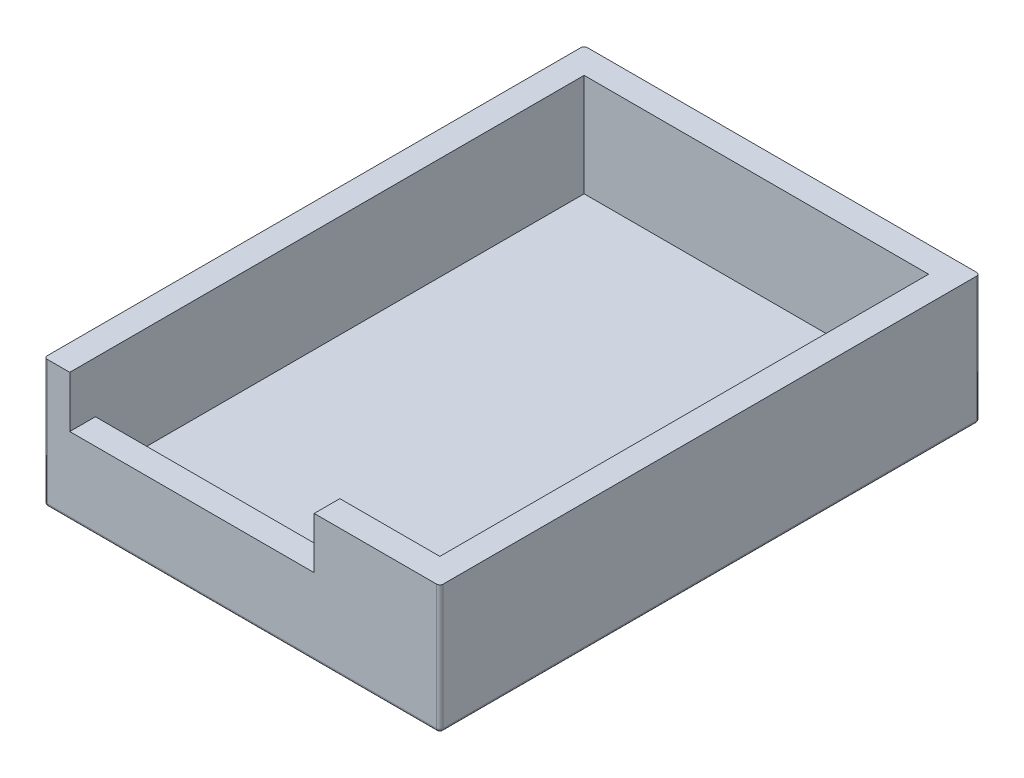
ISO-10303-21;
HEADER;
FILE_DESCRIPTION(('STEP AP214'),'2;1');
FILE_NAME('part.step','',(''),(''),'','','');
FILE_SCHEMA(('AUTOMOTIVE_DESIGN { 1 0 10303 214 1 1 1 1 }'));
ENDSEC;
DATA;
#1=APPLICATION_CONTEXT('core data for automotive mechanical design processes');
#2=APPLICATION_PROTOCOL_DEFINITION('international standard','automotive_design',2000,#1);
#3=PRODUCT_CONTEXT('',#1,'mechanical');
#4=PRODUCT('Part','Part','',(#3));
#5=PRODUCT_RELATED_PRODUCT_CATEGORY('part','',(#4));
#6=PRODUCT_DEFINITION_FORMATION('','',#4);
#7=PRODUCT_DEFINITION_CONTEXT('part definition',#1,'design');
#8=PRODUCT_DEFINITION('design','',#6,#7);
#9=PRODUCT_DEFINITION_SHAPE('','',#8);
#10=(LENGTH_UNIT() NAMED_UNIT(*) SI_UNIT(.MILLI.,.METRE.));
#11=(NAMED_UNIT(*) PLANE_ANGLE_UNIT() SI_UNIT($,.RADIAN.));
#12=(NAMED_UNIT(*) SI_UNIT($,.STERADIAN.) SOLID_ANGLE_UNIT());
#13=UNCERTAINTY_MEASURE_WITH_UNIT(LENGTH_MEASURE(1.E-05),#10,'distance_accuracy_value','');
#14=(GEOMETRIC_REPRESENTATION_CONTEXT(3) GLOBAL_UNCERTAINTY_ASSIGNED_CONTEXT((#13)) GLOBAL_UNIT_ASSIGNED_CONTEXT((#10,
#11,#12)) REPRESENTATION_CONTEXT('',''));
#15=CARTESIAN_POINT('',(0.,0.,0.));
#16=DIRECTION('',(0.,0.,1.));
#17=DIRECTION('',(1.,0.,0.));
#18=AXIS2_PLACEMENT_3D('',#15,#16,#17);
#19=CARTESIAN_POINT('',(0.,10.,0.));
#20=DIRECTION('',(0.,-1.,0.));
#21=DIRECTION('',(0.,0.,-1.));
#22=AXIS2_PLACEMENT_3D('',#19,#20,#21);
#23=PLANE('',#22);
#24=DIRECTION('',(-1.,0.,0.));
#25=VECTOR('',#24,1.);
#26=CARTESIAN_POINT('',(-15.43,10.,-21.055));
#27=LINE('',#26,#25);
#28=CARTESIAN_POINT('',(15.18,10.,-21.055));
#29=VERTEX_POINT('',#28);
#30=CARTESIAN_POINT('',(-15.18,10.,-21.055));
#31=VERTEX_POINT('',#30);
#32=EDGE_CURVE('E218',#29,#31,#27,.T.);
#33=ORIENTED_EDGE('',*,*,#32,.T.);
#34=CARTESIAN_POINT('',(-15.18,10.,-20.805));
#35=DIRECTION('',(0.,-1.,0.));
#36=DIRECTION('',(0.,0.,-1.));
#37=AXIS2_PLACEMENT_3D('',#34,#35,#36);
#38=CIRCLE('',#37,0.25);
#39=CARTESIAN_POINT('',(-15.43,10.,-20.805));
#40=VERTEX_POINT('',#39);
#41=EDGE_CURVE('E255',#31,#40,#38,.F.);
#42=ORIENTED_EDGE('',*,*,#41,.T.);
#43=DIRECTION('',(0.,0.,1.));
#44=VECTOR('',#43,1.);
#45=CARTESIAN_POINT('',(-15.43,10.,21.055));
#46=LINE('',#45,#44);
#47=CARTESIAN_POINT('',(-15.43,10.,20.805));
#48=VERTEX_POINT('',#47);
#49=EDGE_CURVE('E221',#40,#48,#46,.T.);
#50=ORIENTED_EDGE('',*,*,#49,.T.);
#51=CARTESIAN_POINT('',(-15.18,10.,20.805));
#52=DIRECTION('',(0.,-1.,0.));
#53=DIRECTION('',(0.,0.,-1.));
#54=AXIS2_PLACEMENT_3D('',#51,#52,#53);
#55=CIRCLE('',#54,0.25);
#56=CARTESIAN_POINT('',(-15.18,10.,21.055));
#57=VERTEX_POINT('',#56);
#58=EDGE_CURVE('E251',#48,#57,#55,.F.);
#59=ORIENTED_EDGE('',*,*,#58,.T.);
#60=DIRECTION('',(1.,0.,0.));
#61=VECTOR('',#60,1.);
#62=CARTESIAN_POINT('',(-15.43,10.,21.055));
#63=LINE('',#62,#61);
#64=CARTESIAN_POINT('',(-13.43,10.,21.055));
#65=VERTEX_POINT('',#64);
#66=EDGE_CURVE('E225',#57,#65,#63,.T.);
#67=ORIENTED_EDGE('',*,*,#66,.T.);
#68=DIRECTION('',(0.,0.,1.));
#69=VECTOR('',#68,1.);
#70=CARTESIAN_POINT('',(-13.43,10.,0.));
#71=LINE('',#70,#69);
#72=CARTESIAN_POINT('',(-13.43,10.,-19.055));
#73=VERTEX_POINT('',#72);
#74=EDGE_CURVE('E159',#73,#65,#71,.T.);
#75=ORIENTED_EDGE('',*,*,#74,.F.);
#76=DIRECTION('',(-1.,0.,0.));
#77=VECTOR('',#76,1.);
#78=CARTESIAN_POINT('',(0.,10.,-19.055));
#79=LINE('',#78,#77);
#80=CARTESIAN_POINT('',(13.43,10.,-19.055));
#81=VERTEX_POINT('',#80);
#82=EDGE_CURVE('E212',#81,#73,#79,.T.);
#83=ORIENTED_EDGE('',*,*,#82,.F.);
#84=DIRECTION('',(0.,0.,-1.));
#85=VECTOR('',#84,1.);
#86=CARTESIAN_POINT('',(13.43,10.,0.));
#87=LINE('',#86,#85);
#88=CARTESIAN_POINT('',(13.43,10.,19.055));
#89=VERTEX_POINT('',#88);
#90=EDGE_CURVE('E210',#89,#81,#87,.T.);
#91=ORIENTED_EDGE('',*,*,#90,.F.);
#92=DIRECTION('',(1.,0.,0.));
#93=VECTOR('',#92,1.);
#94=CARTESIAN_POINT('',(0.,10.,19.055));
#95=LINE('',#94,#93);
#96=CARTESIAN_POINT('',(5.63,10.,19.055));
#97=VERTEX_POINT('',#96);
#98=EDGE_CURVE('E200',#97,#89,#95,.T.);
#99=ORIENTED_EDGE('',*,*,#98,.F.);
#100=DIRECTION('',(0.,0.,-1.));
#101=VECTOR('',#100,1.);
#102=CARTESIAN_POINT('',(5.63,10.,19.055));
#103=LINE('',#102,#101);
#104=CARTESIAN_POINT('',(5.63,10.,21.055));
#105=VERTEX_POINT('',#104);
#106=EDGE_CURVE('E171',#105,#97,#103,.T.);
#107=ORIENTED_EDGE('',*,*,#106,.F.);
#108=CARTESIAN_POINT('',(15.18,10.,21.055));
#109=VERTEX_POINT('',#108);
#110=EDGE_CURVE('E224',#105,#109,#63,.T.);
#111=ORIENTED_EDGE('',*,*,#110,.T.);
#112=CARTESIAN_POINT('',(15.18,10.,20.805));
#113=DIRECTION('',(0.,-1.,0.));
#114=DIRECTION('',(0.,0.,-1.));
#115=AXIS2_PLACEMENT_3D('',#112,#113,#114);
#116=CIRCLE('',#115,0.25);
#117=CARTESIAN_POINT('',(15.43,10.,20.805));
#118=VERTEX_POINT('',#117);
#119=EDGE_CURVE('E249',#109,#118,#116,.F.);
#120=ORIENTED_EDGE('',*,*,#119,.T.);
#121=DIRECTION('',(0.,0.,-1.));
#122=VECTOR('',#121,1.);
#123=CARTESIAN_POINT('',(15.43,10.,21.055));
#124=LINE('',#123,#122);
#125=CARTESIAN_POINT('',(15.43,10.,-20.805));
#126=VERTEX_POINT('',#125);
#127=EDGE_CURVE('E194',#118,#126,#124,.T.);
#128=ORIENTED_EDGE('',*,*,#127,.T.);
#129=CARTESIAN_POINT('',(15.18,10.,-20.805));
#130=DIRECTION('',(0.,-1.,0.));
#131=DIRECTION('',(0.,0.,-1.));
#132=AXIS2_PLACEMENT_3D('',#129,#130,#131);
#133=CIRCLE('',#132,0.25);
#134=EDGE_CURVE('E253',#126,#29,#133,.F.);
#135=ORIENTED_EDGE('',*,*,#134,.T.);
#136=EDGE_LOOP('',(#33,#42,#50,#59,#67,#75,#83,#91,#99,#107,#111,#120,#128,#135));
#137=FACE_BOUND('',#136,.T.);
#138=ADVANCED_FACE('F33',(#137),#23,.F.);
#139=CARTESIAN_POINT('',(15.43,10.,21.055));
#140=DIRECTION('',(-1.,0.,0.));
#141=DIRECTION('',(0.,0.,1.));
#142=AXIS2_PLACEMENT_3D('',#139,#140,#141);
#143=PLANE('',#142);
#144=DIRECTION('',(0.,0.,-1.));
#145=VECTOR('',#144,1.);
#146=CARTESIAN_POINT('',(15.43,0.25,-21.055));
#147=LINE('',#146,#145);
#148=CARTESIAN_POINT('',(15.43,0.25,20.805));
#149=VERTEX_POINT('',#148);
#150=CARTESIAN_POINT('',(15.43,0.25,-20.805));
#151=VERTEX_POINT('',#150);
#152=EDGE_CURVE('E259',#149,#151,#147,.T.);
#153=ORIENTED_EDGE('',*,*,#152,.T.);
#154=DIRECTION('',(0.,-1.,0.));
#155=VECTOR('',#154,1.);
#156=CARTESIAN_POINT('',(15.43,10.,-20.805));
#157=LINE('',#156,#155);
#158=EDGE_CURVE('E261',#151,#126,#157,.F.);
#159=ORIENTED_EDGE('',*,*,#158,.T.);
#160=ORIENTED_EDGE('',*,*,#127,.F.);
#161=DIRECTION('',(0.,-1.,0.));
#162=VECTOR('',#161,1.);
#163=CARTESIAN_POINT('',(15.43,10.,20.805));
#164=LINE('',#163,#162);
#165=EDGE_CURVE('E257',#118,#149,#164,.T.);
#166=ORIENTED_EDGE('',*,*,#165,.T.);
#167=EDGE_LOOP('',(#153,#159,#160,#166));
#168=FACE_BOUND('',#167,.T.);
#169=ADVANCED_FACE('F404',(#168),#143,.F.);
#170=CARTESIAN_POINT('',(-15.43,10.,-21.055));
#171=DIRECTION('',(0.,0.,1.));
#172=DIRECTION('',(1.,0.,0.));
#173=AXIS2_PLACEMENT_3D('',#170,#171,#172);
#174=PLANE('',#173);
#175=DIRECTION('',(-1.,0.,0.));
#176=VECTOR('',#175,1.);
#177=CARTESIAN_POINT('',(-15.43,0.25,-21.055));
#178=LINE('',#177,#176);
#179=CARTESIAN_POINT('',(15.18,0.25,-21.055));
#180=VERTEX_POINT('',#179);
#181=CARTESIAN_POINT('',(-15.18,0.25,-21.055));
#182=VERTEX_POINT('',#181);
#183=EDGE_CURVE('E229',#180,#182,#178,.T.);
#184=ORIENTED_EDGE('',*,*,#183,.T.);
#185=DIRECTION('',(0.,-1.,0.));
#186=VECTOR('',#185,1.);
#187=CARTESIAN_POINT('',(-15.18,10.,-21.055));
#188=LINE('',#187,#186);
#189=EDGE_CURVE('E232',#182,#31,#188,.F.);
#190=ORIENTED_EDGE('',*,*,#189,.T.);
#191=ORIENTED_EDGE('',*,*,#32,.F.);
#192=DIRECTION('',(0.,-1.,0.));
#193=VECTOR('',#192,1.);
#194=CARTESIAN_POINT('',(15.18,10.,-21.055));
#195=LINE('',#194,#193);
#196=EDGE_CURVE('E227',#29,#180,#195,.T.);
#197=ORIENTED_EDGE('',*,*,#196,.T.);
#198=EDGE_LOOP('',(#184,#190,#191,#197));
#199=FACE_BOUND('',#198,.T.);
#200=ADVANCED_FACE('F343',(#199),#174,.F.);
#201=CARTESIAN_POINT('',(-15.43,10.,21.055));
#202=DIRECTION('',(1.,0.,0.));
#203=DIRECTION('',(0.,0.,-1.));
#204=AXIS2_PLACEMENT_3D('',#201,#202,#203);
#205=PLANE('',#204);
#206=ORIENTED_EDGE('',*,*,#49,.F.);
#207=DIRECTION('',(0.,-1.,0.));
#208=VECTOR('',#207,1.);
#209=CARTESIAN_POINT('',(-15.43,10.,-20.805));
#210=LINE('',#209,#208);
#211=CARTESIAN_POINT('',(-15.43,0.25,-20.805));
#212=VERTEX_POINT('',#211);
#213=EDGE_CURVE('E247',#40,#212,#210,.T.);
#214=ORIENTED_EDGE('',*,*,#213,.T.);
#215=DIRECTION('',(0.,0.,1.));
#216=VECTOR('',#215,1.);
#217=CARTESIAN_POINT('',(-15.43,0.25,21.055));
#218=LINE('',#217,#216);
#219=CARTESIAN_POINT('',(-15.43,0.25,20.805));
#220=VERTEX_POINT('',#219);
#221=EDGE_CURVE('E245',#212,#220,#218,.T.);
#222=ORIENTED_EDGE('',*,*,#221,.T.);
#223=DIRECTION('',(0.,-1.,0.));
#224=VECTOR('',#223,1.);
#225=CARTESIAN_POINT('',(-15.43,10.,20.805));
#226=LINE('',#225,#224);
#227=EDGE_CURVE('E243',#220,#48,#226,.F.);
#228=ORIENTED_EDGE('',*,*,#227,.T.);
#229=EDGE_LOOP('',(#206,#214,#222,#228));
#230=FACE_BOUND('',#229,.T.);
#231=ADVANCED_FACE('F416',(#230),#205,.F.);
#232=CARTESIAN_POINT('',(-15.43,10.,21.055));
#233=DIRECTION('',(0.,0.,-1.));
#234=DIRECTION('',(-1.,0.,0.));
#235=AXIS2_PLACEMENT_3D('',#232,#233,#234);
#236=PLANE('',#235);
#237=ORIENTED_EDGE('',*,*,#66,.F.);
#238=DIRECTION('',(0.,-1.,0.));
#239=VECTOR('',#238,1.);
#240=CARTESIAN_POINT('',(-15.18,10.,21.055));
#241=LINE('',#240,#239);
#242=CARTESIAN_POINT('',(-15.18,0.25,21.055));
#243=VERTEX_POINT('',#242);
#244=EDGE_CURVE('E11',#57,#243,#241,.T.);
#245=ORIENTED_EDGE('',*,*,#244,.T.);
#246=DIRECTION('',(1.,0.,0.));
#247=VECTOR('',#246,1.);
#248=CARTESIAN_POINT('',(15.43,0.25,21.055));
#249=LINE('',#248,#247);
#250=CARTESIAN_POINT('',(15.18,0.25,21.055));
#251=VERTEX_POINT('',#250);
#252=EDGE_CURVE('E49',#243,#251,#249,.T.);
#253=ORIENTED_EDGE('',*,*,#252,.T.);
#254=DIRECTION('',(0.,-1.,0.));
#255=VECTOR('',#254,1.);
#256=CARTESIAN_POINT('',(15.18,10.,21.055));
#257=LINE('',#256,#255);
#258=EDGE_CURVE('E42',#251,#109,#257,.F.);
#259=ORIENTED_EDGE('',*,*,#258,.T.);
#260=ORIENTED_EDGE('',*,*,#110,.F.);
#261=DIRECTION('',(0.,1.,0.));
#262=VECTOR('',#261,1.);
#263=CARTESIAN_POINT('',(5.63,6.,21.055));
#264=LINE('',#263,#262);
#265=CARTESIAN_POINT('',(5.63,6.,21.055));
#266=VERTEX_POINT('',#265);
#267=EDGE_CURVE('E161',#266,#105,#264,.T.);
#268=ORIENTED_EDGE('',*,*,#267,.F.);
#269=DIRECTION('',(1.,0.,0.));
#270=VECTOR('',#269,1.);
#271=CARTESIAN_POINT('',(-13.43,6.,21.055));
#272=LINE('',#271,#270);
#273=CARTESIAN_POINT('',(-13.43,6.,21.055));
#274=VERTEX_POINT('',#273);
#275=EDGE_CURVE('E167',#274,#266,#272,.T.);
#276=ORIENTED_EDGE('',*,*,#275,.F.);
#277=DIRECTION('',(0.,1.,0.));
#278=VECTOR('',#277,1.);
#279=CARTESIAN_POINT('',(-13.43,6.,21.055));
#280=LINE('',#279,#278);
#281=EDGE_CURVE('E151',#274,#65,#280,.T.);
#282=ORIENTED_EDGE('',*,*,#281,.T.);
#283=EDGE_LOOP('',(#237,#245,#253,#259,#260,#268,#276,#282));
#284=FACE_BOUND('',#283,.T.);
#285=ADVANCED_FACE('F173',(#284),#236,.F.);
#286=CARTESIAN_POINT('',(0.,0.,0.));
#287=DIRECTION('',(0.,-1.,0.));
#288=DIRECTION('',(0.,0.,-1.));
#289=AXIS2_PLACEMENT_3D('',#286,#287,#288);
#290=PLANE('',#289);
#291=CARTESIAN_POINT('',(8.57859953076201,0.,12.725824802734));
#292=DIRECTION('',(0.,-1.,0.));
#293=DIRECTION('',(0.,0.,-1.));
#294=AXIS2_PLACEMENT_3D('',#291,#292,#293);
#295=CIRCLE('',#294,1.5);
#296=CARTESIAN_POINT('',(8.57859953076201,0.,11.225824802734));
#297=VERTEX_POINT('',#296);
#298=EDGE_CURVE('E306',#297,#297,#295,.T.);
#299=ORIENTED_EDGE('',*,*,#298,.F.);
#300=EDGE_LOOP('',(#299));
#301=FACE_BOUND('',#300,.T.);
#302=CARTESIAN_POINT('',(3.95554502636701,0.,15.646822422363));
#303=DIRECTION('',(0.,-1.,0.));
#304=DIRECTION('',(0.,0.,-1.));
#305=AXIS2_PLACEMENT_3D('',#302,#303,#304);
#306=CIRCLE('',#305,1.5);
#307=CARTESIAN_POINT('',(3.95554502636701,0.,14.146822422363));
#308=VERTEX_POINT('',#307);
#309=EDGE_CURVE('E299',#308,#308,#306,.T.);
#310=ORIENTED_EDGE('',*,*,#309,.F.);
#311=EDGE_LOOP('',(#310));
#312=FACE_BOUND('',#311,.T.);
#313=DIRECTION('',(0.,0.,1.));
#314=VECTOR('',#313,1.);
#315=CARTESIAN_POINT('',(-15.18,0.,-21.055));
#316=LINE('',#315,#314);
#317=CARTESIAN_POINT('',(-15.18,0.,20.805));
#318=VERTEX_POINT('',#317);
#319=CARTESIAN_POINT('',(-15.18,0.,-20.805));
#320=VERTEX_POINT('',#319);
#321=EDGE_CURVE('E238',#318,#320,#316,.F.);
#322=ORIENTED_EDGE('',*,*,#321,.T.);
#323=DIRECTION('',(-1.,0.,0.));
#324=VECTOR('',#323,1.);
#325=CARTESIAN_POINT('',(15.43,0.,-20.805));
#326=LINE('',#325,#324);
#327=CARTESIAN_POINT('',(15.18,0.,-20.805));
#328=VERTEX_POINT('',#327);
#329=EDGE_CURVE('E240',#320,#328,#326,.F.);
#330=ORIENTED_EDGE('',*,*,#329,.T.);
#331=DIRECTION('',(0.,0.,-1.));
#332=VECTOR('',#331,1.);
#333=CARTESIAN_POINT('',(15.18,0.,21.055));
#334=LINE('',#333,#332);
#335=CARTESIAN_POINT('',(15.18,0.,20.805));
#336=VERTEX_POINT('',#335);
#337=EDGE_CURVE('E236',#328,#336,#334,.F.);
#338=ORIENTED_EDGE('',*,*,#337,.T.);
#339=DIRECTION('',(1.,0.,0.));
#340=VECTOR('',#339,1.);
#341=CARTESIAN_POINT('',(-15.43,0.,20.805));
#342=LINE('',#341,#340);
#343=EDGE_CURVE('E234',#336,#318,#342,.F.);
#344=ORIENTED_EDGE('',*,*,#343,.T.);
#345=EDGE_LOOP('',(#322,#330,#338,#344));
#346=FACE_BOUND('',#345,.T.);
#347=ADVANCED_FACE('F314',(#301,#312,#346),#290,.T.);
#348=CARTESIAN_POINT('',(13.43,10.,21.055));
#349=DIRECTION('',(-1.,0.,0.));
#350=DIRECTION('',(0.,0.,1.));
#351=AXIS2_PLACEMENT_3D('',#348,#349,#350);
#352=PLANE('',#351);
#353=DIRECTION('',(0.,0.,-1.));
#354=VECTOR('',#353,1.);
#355=CARTESIAN_POINT('',(13.43,2.,0.));
#356=LINE('',#355,#354);
#357=CARTESIAN_POINT('',(13.43,2.,19.055));
#358=VERTEX_POINT('',#357);
#359=CARTESIAN_POINT('',(13.43,2.,-19.055));
#360=VERTEX_POINT('',#359);
#361=EDGE_CURVE('E186',#358,#360,#356,.T.);
#362=ORIENTED_EDGE('',*,*,#361,.F.);
#363=DIRECTION('',(0.,-1.,0.));
#364=VECTOR('',#363,1.);
#365=CARTESIAN_POINT('',(13.43,10.,19.055));
#366=LINE('',#365,#364);
#367=EDGE_CURVE('E196',#89,#358,#366,.T.);
#368=ORIENTED_EDGE('',*,*,#367,.F.);
#369=ORIENTED_EDGE('',*,*,#90,.T.);
#370=DIRECTION('',(0.,-1.,0.));
#371=VECTOR('',#370,1.);
#372=CARTESIAN_POINT('',(13.43,10.,-19.055));
#373=LINE('',#372,#371);
#374=EDGE_CURVE('E191',#81,#360,#373,.T.);
#375=ORIENTED_EDGE('',*,*,#374,.T.);
#376=EDGE_LOOP('',(#362,#368,#369,#375));
#377=FACE_BOUND('',#376,.T.);
#378=ADVANCED_FACE('F317',(#377),#352,.T.);
#379=CARTESIAN_POINT('',(-15.43,10.,-19.055));
#380=DIRECTION('',(0.,0.,1.));
#381=DIRECTION('',(1.,0.,0.));
#382=AXIS2_PLACEMENT_3D('',#379,#380,#381);
#383=PLANE('',#382);
#384=DIRECTION('',(-1.,0.,0.));
#385=VECTOR('',#384,1.);
#386=CARTESIAN_POINT('',(0.,2.,-19.055));
#387=LINE('',#386,#385);
#388=CARTESIAN_POINT('',(-13.43,2.,-19.055));
#389=VERTEX_POINT('',#388);
#390=EDGE_CURVE('E190',#360,#389,#387,.T.);
#391=ORIENTED_EDGE('',*,*,#390,.F.);
#392=ORIENTED_EDGE('',*,*,#374,.F.);
#393=ORIENTED_EDGE('',*,*,#82,.T.);
#394=DIRECTION('',(0.,-1.,0.));
#395=VECTOR('',#394,1.);
#396=CARTESIAN_POINT('',(-13.43,10.,-19.055));
#397=LINE('',#396,#395);
#398=EDGE_CURVE('E195',#73,#389,#397,.T.);
#399=ORIENTED_EDGE('',*,*,#398,.T.);
#400=EDGE_LOOP('',(#391,#392,#393,#399));
#401=FACE_BOUND('',#400,.T.);
#402=ADVANCED_FACE('F386',(#401),#383,.T.);
#403=CARTESIAN_POINT('',(-13.43,10.,21.055));
#404=DIRECTION('',(1.,0.,0.));
#405=DIRECTION('',(0.,0.,-1.));
#406=AXIS2_PLACEMENT_3D('',#403,#404,#405);
#407=PLANE('',#406);
#408=DIRECTION('',(0.,0.,1.));
#409=VECTOR('',#408,1.);
#410=CARTESIAN_POINT('',(-13.43,2.,0.));
#411=LINE('',#410,#409);
#412=CARTESIAN_POINT('',(-13.43,2.,19.055));
#413=VERTEX_POINT('',#412);
#414=EDGE_CURVE('E202',#389,#413,#411,.T.);
#415=ORIENTED_EDGE('',*,*,#414,.F.);
#416=ORIENTED_EDGE('',*,*,#398,.F.);
#417=ORIENTED_EDGE('',*,*,#74,.T.);
#418=ORIENTED_EDGE('',*,*,#281,.F.);
#419=DIRECTION('',(0.,0.,1.));
#420=VECTOR('',#419,1.);
#421=CARTESIAN_POINT('',(-13.43,6.,19.055));
#422=LINE('',#421,#420);
#423=CARTESIAN_POINT('',(-13.43,6.,19.055));
#424=VERTEX_POINT('',#423);
#425=EDGE_CURVE('E155',#424,#274,#422,.T.);
#426=ORIENTED_EDGE('',*,*,#425,.F.);
#427=DIRECTION('',(0.,-1.,0.));
#428=VECTOR('',#427,1.);
#429=CARTESIAN_POINT('',(-13.43,10.,19.055));
#430=LINE('',#429,#428);
#431=EDGE_CURVE('E199',#424,#413,#430,.T.);
#432=ORIENTED_EDGE('',*,*,#431,.T.);
#433=EDGE_LOOP('',(#415,#416,#417,#418,#426,#432));
#434=FACE_BOUND('',#433,.T.);
#435=ADVANCED_FACE('F154',(#434),#407,.T.);
#436=CARTESIAN_POINT('',(-15.43,10.,19.055));
#437=DIRECTION('',(0.,0.,-1.));
#438=DIRECTION('',(-1.,0.,0.));
#439=AXIS2_PLACEMENT_3D('',#436,#437,#438);
#440=PLANE('',#439);
#441=DIRECTION('',(0.,1.,0.));
#442=VECTOR('',#441,1.);
#443=CARTESIAN_POINT('',(5.63,6.,19.055));
#444=LINE('',#443,#442);
#445=CARTESIAN_POINT('',(5.63,6.,19.055));
#446=VERTEX_POINT('',#445);
#447=EDGE_CURVE('E183',#446,#97,#444,.T.);
#448=ORIENTED_EDGE('',*,*,#447,.T.);
#449=ORIENTED_EDGE('',*,*,#98,.T.);
#450=ORIENTED_EDGE('',*,*,#367,.T.);
#451=DIRECTION('',(1.,0.,0.));
#452=VECTOR('',#451,1.);
#453=CARTESIAN_POINT('',(0.,2.,19.055));
#454=LINE('',#453,#452);
#455=EDGE_CURVE('E207',#413,#358,#454,.T.);
#456=ORIENTED_EDGE('',*,*,#455,.F.);
#457=ORIENTED_EDGE('',*,*,#431,.F.);
#458=DIRECTION('',(-1.,0.,0.));
#459=VECTOR('',#458,1.);
#460=CARTESIAN_POINT('',(-13.43,6.,19.055));
#461=LINE('',#460,#459);
#462=EDGE_CURVE('E162',#446,#424,#461,.T.);
#463=ORIENTED_EDGE('',*,*,#462,.F.);
#464=EDGE_LOOP('',(#448,#449,#450,#456,#457,#463));
#465=FACE_BOUND('',#464,.T.);
#466=ADVANCED_FACE('F378',(#465),#440,.T.);
#467=CARTESIAN_POINT('',(0.,2.,0.));
#468=DIRECTION('',(0.,-1.,0.));
#469=DIRECTION('',(0.,0.,-1.));
#470=AXIS2_PLACEMENT_3D('',#467,#468,#469);
#471=PLANE('',#470);
#472=CARTESIAN_POINT('',(8.57859953076201,2.,12.725824802734));
#473=DIRECTION('',(0.,-1.,0.));
#474=DIRECTION('',(0.,0.,-1.));
#475=AXIS2_PLACEMENT_3D('',#472,#473,#474);
#476=CIRCLE('',#475,1.5);
#477=CARTESIAN_POINT('',(8.57859953076201,2.,11.225824802734));
#478=VERTEX_POINT('',#477);
#479=EDGE_CURVE('E37',#478,#478,#476,.T.);
#480=ORIENTED_EDGE('',*,*,#479,.T.);
#481=EDGE_LOOP('',(#480));
#482=FACE_BOUND('',#481,.T.);
#483=CARTESIAN_POINT('',(3.95554502636701,2.,15.646822422363));
#484=DIRECTION('',(0.,-1.,0.));
#485=DIRECTION('',(0.,0.,-1.));
#486=AXIS2_PLACEMENT_3D('',#483,#484,#485);
#487=CIRCLE('',#486,1.5);
#488=CARTESIAN_POINT('',(3.95554502636701,2.,14.146822422363));
#489=VERTEX_POINT('',#488);
#490=EDGE_CURVE('E268',#489,#489,#487,.T.);
#491=ORIENTED_EDGE('',*,*,#490,.T.);
#492=EDGE_LOOP('',(#491));
#493=FACE_BOUND('',#492,.T.);
#494=ORIENTED_EDGE('',*,*,#361,.T.);
#495=ORIENTED_EDGE('',*,*,#390,.T.);
#496=ORIENTED_EDGE('',*,*,#414,.T.);
#497=ORIENTED_EDGE('',*,*,#455,.T.);
#498=EDGE_LOOP('',(#494,#495,#496,#497));
#499=FACE_BOUND('',#498,.T.);
#500=ADVANCED_FACE('F382',(#482,#493,#499),#471,.F.);
#501=CARTESIAN_POINT('',(5.63,6.,19.055));
#502=DIRECTION('',(1.,0.,0.));
#503=DIRECTION('',(0.,0.,-1.));
#504=AXIS2_PLACEMENT_3D('',#501,#502,#503);
#505=PLANE('',#504);
#506=ORIENTED_EDGE('',*,*,#106,.T.);
#507=ORIENTED_EDGE('',*,*,#447,.F.);
#508=DIRECTION('',(0.,0.,-1.));
#509=VECTOR('',#508,1.);
#510=CARTESIAN_POINT('',(5.63,6.,19.055));
#511=LINE('',#510,#509);
#512=EDGE_CURVE('E175',#266,#446,#511,.T.);
#513=ORIENTED_EDGE('',*,*,#512,.F.);
#514=ORIENTED_EDGE('',*,*,#267,.T.);
#515=EDGE_LOOP('',(#506,#507,#513,#514));
#516=FACE_BOUND('',#515,.T.);
#517=ADVANCED_FACE('F376',(#516),#505,.F.);
#518=CARTESIAN_POINT('',(0.,6.,0.));
#519=DIRECTION('',(0.,1.,0.));
#520=DIRECTION('',(0.,0.,1.));
#521=AXIS2_PLACEMENT_3D('',#518,#519,#520);
#522=PLANE('',#521);
#523=ORIENTED_EDGE('',*,*,#425,.T.);
#524=ORIENTED_EDGE('',*,*,#275,.T.);
#525=ORIENTED_EDGE('',*,*,#512,.T.);
#526=ORIENTED_EDGE('',*,*,#462,.T.);
#527=EDGE_LOOP('',(#523,#524,#525,#526));
#528=FACE_BOUND('',#527,.T.);
#529=ADVANCED_FACE('F166',(#528),#522,.T.);
#530=CARTESIAN_POINT('',(15.18,10.,20.805));
#531=DIRECTION('',(0.,-1.,0.));
#532=DIRECTION('',(0.,0.,-1.));
#533=AXIS2_PLACEMENT_3D('',#530,#531,#532);
#534=CYLINDRICAL_SURFACE('',#533,0.25);
#535=ORIENTED_EDGE('',*,*,#119,.F.);
#536=ORIENTED_EDGE('',*,*,#258,.F.);
#537=CARTESIAN_POINT('',(15.18,0.25,20.805));
#538=DIRECTION('',(0.,-1.,0.));
#539=DIRECTION('',(0.,0.,-1.));
#540=AXIS2_PLACEMENT_3D('',#537,#538,#539);
#541=CIRCLE('',#540,0.25);
#542=EDGE_CURVE('E294',#149,#251,#541,.T.);
#543=ORIENTED_EDGE('',*,*,#542,.F.);
#544=ORIENTED_EDGE('',*,*,#165,.F.);
#545=EDGE_LOOP('',(#535,#536,#543,#544));
#546=FACE_BOUND('',#545,.T.);
#547=ADVANCED_FACE('F35',(#546),#534,.T.);
#548=CARTESIAN_POINT('',(-15.18,10.,20.805));
#549=DIRECTION('',(0.,-1.,0.));
#550=DIRECTION('',(0.,0.,-1.));
#551=AXIS2_PLACEMENT_3D('',#548,#549,#550);
#552=CYLINDRICAL_SURFACE('',#551,0.25);
#553=ORIENTED_EDGE('',*,*,#58,.F.);
#554=ORIENTED_EDGE('',*,*,#227,.F.);
#555=CARTESIAN_POINT('',(-15.18,0.25,20.805));
#556=DIRECTION('',(0.,-1.,0.));
#557=DIRECTION('',(0.,0.,-1.));
#558=AXIS2_PLACEMENT_3D('',#555,#556,#557);
#559=CIRCLE('',#558,0.25);
#560=EDGE_CURVE('E291',#243,#220,#559,.T.);
#561=ORIENTED_EDGE('',*,*,#560,.F.);
#562=ORIENTED_EDGE('',*,*,#244,.F.);
#563=EDGE_LOOP('',(#553,#554,#561,#562));
#564=FACE_BOUND('',#563,.T.);
#565=ADVANCED_FACE('F391',(#564),#552,.T.);
#566=CARTESIAN_POINT('',(-15.43,0.25,20.805));
#567=DIRECTION('',(-1.,0.,0.));
#568=DIRECTION('',(0.,0.,1.));
#569=AXIS2_PLACEMENT_3D('',#566,#567,#568);
#570=CYLINDRICAL_SURFACE('',#569,0.25);
#571=CARTESIAN_POINT('',(15.18,0.25,20.805));
#572=DIRECTION('',(1.,0.,0.));
#573=DIRECTION('',(0.,0.,-1.));
#574=AXIS2_PLACEMENT_3D('',#571,#572,#573);
#575=CIRCLE('',#574,0.25);
#576=EDGE_CURVE('E182',#251,#336,#575,.T.);
#577=ORIENTED_EDGE('',*,*,#576,.F.);
#578=ORIENTED_EDGE('',*,*,#252,.F.);
#579=CARTESIAN_POINT('',(-15.18,0.25,20.805));
#580=DIRECTION('',(-1.,0.,0.));
#581=DIRECTION('',(0.,0.,1.));
#582=AXIS2_PLACEMENT_3D('',#579,#580,#581);
#583=CIRCLE('',#582,0.25);
#584=EDGE_CURVE('E288',#318,#243,#583,.T.);
#585=ORIENTED_EDGE('',*,*,#584,.F.);
#586=ORIENTED_EDGE('',*,*,#343,.F.);
#587=EDGE_LOOP('',(#577,#578,#585,#586));
#588=FACE_BOUND('',#587,.T.);
#589=ADVANCED_FACE('F360',(#588),#570,.T.);
#590=CARTESIAN_POINT('',(15.18,0.25,20.805));
#591=DIRECTION('',(0.,0.,1.));
#592=DIRECTION('',(1.,0.,0.));
#593=AXIS2_PLACEMENT_3D('',#590,#591,#592);
#594=SPHERICAL_SURFACE('',#593,0.25);
#595=ORIENTED_EDGE('',*,*,#542,.T.);
#596=ORIENTED_EDGE('',*,*,#576,.T.);
#597=CARTESIAN_POINT('',(15.18,0.25,20.805));
#598=DIRECTION('',(0.,0.,1.));
#599=DIRECTION('',(1.,0.,0.));
#600=AXIS2_PLACEMENT_3D('',#597,#598,#599);
#601=CIRCLE('',#600,0.25);
#602=EDGE_CURVE('E285',#149,#336,#601,.F.);
#603=ORIENTED_EDGE('',*,*,#602,.F.);
#604=EDGE_LOOP('',(#595,#596,#603));
#605=FACE_BOUND('',#604,.T.);
#606=ADVANCED_FACE('F363',(#605),#594,.T.);
#607=CARTESIAN_POINT('',(-15.18,0.25,20.805));
#608=DIRECTION('',(0.,0.,1.));
#609=DIRECTION('',(1.,0.,0.));
#610=AXIS2_PLACEMENT_3D('',#607,#608,#609);
#611=SPHERICAL_SURFACE('',#610,0.25);
#612=ORIENTED_EDGE('',*,*,#584,.T.);
#613=ORIENTED_EDGE('',*,*,#560,.T.);
#614=CARTESIAN_POINT('',(-15.18,0.25,20.805));
#615=DIRECTION('',(0.,0.,1.));
#616=DIRECTION('',(1.,0.,0.));
#617=AXIS2_PLACEMENT_3D('',#614,#615,#616);
#618=CIRCLE('',#617,0.25);
#619=EDGE_CURVE('E282',#318,#220,#618,.F.);
#620=ORIENTED_EDGE('',*,*,#619,.F.);
#621=EDGE_LOOP('',(#612,#613,#620));
#622=FACE_BOUND('',#621,.T.);
#623=ADVANCED_FACE('F394',(#622),#611,.T.);
#624=CARTESIAN_POINT('',(15.18,0.25,21.055));
#625=DIRECTION('',(0.,0.,1.));
#626=DIRECTION('',(1.,0.,0.));
#627=AXIS2_PLACEMENT_3D('',#624,#625,#626);
#628=CYLINDRICAL_SURFACE('',#627,0.25);
#629=ORIENTED_EDGE('',*,*,#602,.T.);
#630=ORIENTED_EDGE('',*,*,#337,.F.);
#631=CARTESIAN_POINT('',(15.18,0.25,-20.805));
#632=DIRECTION('',(0.,0.,-1.));
#633=DIRECTION('',(-1.,0.,0.));
#634=AXIS2_PLACEMENT_3D('',#631,#632,#633);
#635=CIRCLE('',#634,0.25);
#636=EDGE_CURVE('E279',#151,#328,#635,.T.);
#637=ORIENTED_EDGE('',*,*,#636,.F.);
#638=ORIENTED_EDGE('',*,*,#152,.F.);
#639=EDGE_LOOP('',(#629,#630,#637,#638));
#640=FACE_BOUND('',#639,.T.);
#641=ADVANCED_FACE('F356',(#640),#628,.T.);
#642=CARTESIAN_POINT('',(15.18,10.,-20.805));
#643=DIRECTION('',(0.,-1.,0.));
#644=DIRECTION('',(0.,0.,-1.));
#645=AXIS2_PLACEMENT_3D('',#642,#643,#644);
#646=CYLINDRICAL_SURFACE('',#645,0.25);
#647=ORIENTED_EDGE('',*,*,#134,.F.);
#648=ORIENTED_EDGE('',*,*,#158,.F.);
#649=CARTESIAN_POINT('',(15.18,0.25,-20.805));
#650=DIRECTION('',(0.,-1.,0.));
#651=DIRECTION('',(0.,0.,-1.));
#652=AXIS2_PLACEMENT_3D('',#649,#650,#651);
#653=CIRCLE('',#652,0.25);
#654=EDGE_CURVE('E276',#180,#151,#653,.T.);
#655=ORIENTED_EDGE('',*,*,#654,.F.);
#656=ORIENTED_EDGE('',*,*,#196,.F.);
#657=EDGE_LOOP('',(#647,#648,#655,#656));
#658=FACE_BOUND('',#657,.T.);
#659=ADVANCED_FACE('F349',(#658),#646,.T.);
#660=CARTESIAN_POINT('',(-15.18,10.,-20.805));
#661=DIRECTION('',(0.,-1.,0.));
#662=DIRECTION('',(0.,0.,-1.));
#663=AXIS2_PLACEMENT_3D('',#660,#661,#662);
#664=CYLINDRICAL_SURFACE('',#663,0.25);
#665=ORIENTED_EDGE('',*,*,#41,.F.);
#666=ORIENTED_EDGE('',*,*,#189,.F.);
#667=CARTESIAN_POINT('',(-15.18,0.25,-20.805));
#668=DIRECTION('',(0.,-1.,0.));
#669=DIRECTION('',(0.,0.,-1.));
#670=AXIS2_PLACEMENT_3D('',#667,#668,#669);
#671=CIRCLE('',#670,0.25);
#672=EDGE_CURVE('E273',#212,#182,#671,.T.);
#673=ORIENTED_EDGE('',*,*,#672,.F.);
#674=ORIENTED_EDGE('',*,*,#213,.F.);
#675=EDGE_LOOP('',(#665,#666,#673,#674));
#676=FACE_BOUND('',#675,.T.);
#677=ADVANCED_FACE('F340',(#676),#664,.T.);
#678=CARTESIAN_POINT('',(-15.18,0.25,21.055));
#679=DIRECTION('',(0.,0.,-1.));
#680=DIRECTION('',(-1.,0.,0.));
#681=AXIS2_PLACEMENT_3D('',#678,#679,#680);
#682=CYLINDRICAL_SURFACE('',#681,0.25);
#683=ORIENTED_EDGE('',*,*,#619,.T.);
#684=ORIENTED_EDGE('',*,*,#221,.F.);
#685=CARTESIAN_POINT('',(-15.18,0.25,-20.805));
#686=DIRECTION('',(0.,0.,-1.));
#687=DIRECTION('',(-1.,0.,0.));
#688=AXIS2_PLACEMENT_3D('',#685,#686,#687);
#689=CIRCLE('',#688,0.25);
#690=EDGE_CURVE('E270',#320,#212,#689,.T.);
#691=ORIENTED_EDGE('',*,*,#690,.F.);
#692=ORIENTED_EDGE('',*,*,#321,.F.);
#693=EDGE_LOOP('',(#683,#684,#691,#692));
#694=FACE_BOUND('',#693,.T.);
#695=ADVANCED_FACE('F327',(#694),#682,.T.);
#696=CARTESIAN_POINT('',(15.18,0.25,-20.805));
#697=DIRECTION('',(0.,0.,1.));
#698=DIRECTION('',(1.,0.,0.));
#699=AXIS2_PLACEMENT_3D('',#696,#697,#698);
#700=SPHERICAL_SURFACE('',#699,0.25);
#701=ORIENTED_EDGE('',*,*,#654,.T.);
#702=ORIENTED_EDGE('',*,*,#636,.T.);
#703=CARTESIAN_POINT('',(15.18,0.25,-20.805));
#704=DIRECTION('',(1.,0.,0.));
#705=DIRECTION('',(0.,0.,-1.));
#706=AXIS2_PLACEMENT_3D('',#703,#704,#705);
#707=CIRCLE('',#706,0.25);
#708=EDGE_CURVE('E267',#180,#328,#707,.F.);
#709=ORIENTED_EDGE('',*,*,#708,.F.);
#710=EDGE_LOOP('',(#701,#702,#709));
#711=FACE_BOUND('',#710,.T.);
#712=ADVANCED_FACE('F352',(#711),#700,.T.);
#713=CARTESIAN_POINT('',(-15.18,0.25,-20.805));
#714=DIRECTION('',(0.,0.,1.));
#715=DIRECTION('',(1.,0.,0.));
#716=AXIS2_PLACEMENT_3D('',#713,#714,#715);
#717=SPHERICAL_SURFACE('',#716,0.25);
#718=ORIENTED_EDGE('',*,*,#690,.T.);
#719=ORIENTED_EDGE('',*,*,#672,.T.);
#720=CARTESIAN_POINT('',(-15.18,0.25,-20.805));
#721=DIRECTION('',(-1.,0.,0.));
#722=DIRECTION('',(0.,0.,1.));
#723=AXIS2_PLACEMENT_3D('',#720,#721,#722);
#724=CIRCLE('',#723,0.25);
#725=EDGE_CURVE('E265',#320,#182,#724,.F.);
#726=ORIENTED_EDGE('',*,*,#725,.F.);
#727=EDGE_LOOP('',(#718,#719,#726));
#728=FACE_BOUND('',#727,.T.);
#729=ADVANCED_FACE('F335',(#728),#717,.T.);
#730=CARTESIAN_POINT('',(-15.43,0.25,-20.805));
#731=DIRECTION('',(1.,0.,0.));
#732=DIRECTION('',(0.,0.,-1.));
#733=AXIS2_PLACEMENT_3D('',#730,#731,#732);
#734=CYLINDRICAL_SURFACE('',#733,0.25);
#735=ORIENTED_EDGE('',*,*,#708,.T.);
#736=ORIENTED_EDGE('',*,*,#329,.F.);
#737=ORIENTED_EDGE('',*,*,#725,.T.);
#738=ORIENTED_EDGE('',*,*,#183,.F.);
#739=EDGE_LOOP('',(#735,#736,#737,#738));
#740=FACE_BOUND('',#739,.T.);
#741=ADVANCED_FACE('F332',(#740),#734,.T.);
#742=CARTESIAN_POINT('',(3.95554502636701,10.,15.646822422363));
#743=DIRECTION('',(0.,-1.,0.));
#744=DIRECTION('',(0.,0.,-1.));
#745=AXIS2_PLACEMENT_3D('',#742,#743,#744);
#746=CYLINDRICAL_SURFACE('',#745,1.5);
#747=ORIENTED_EDGE('',*,*,#309,.T.);
#748=EDGE_LOOP('',(#747));
#749=FACE_BOUND('',#748,.T.);
#750=ORIENTED_EDGE('',*,*,#490,.F.);
#751=EDGE_LOOP('',(#750));
#752=FACE_BOUND('',#751,.T.);
#753=ADVANCED_FACE('F424',(#749,#752),#746,.F.);
#754=CARTESIAN_POINT('',(8.57859953076201,10.,12.725824802734));
#755=DIRECTION('',(0.,-1.,0.));
#756=DIRECTION('',(0.,0.,-1.));
#757=AXIS2_PLACEMENT_3D('',#754,#755,#756);
#758=CYLINDRICAL_SURFACE('',#757,1.5);
#759=ORIENTED_EDGE('',*,*,#298,.T.);
#760=EDGE_LOOP('',(#759));
#761=FACE_BOUND('',#760,.T.);
#762=ORIENTED_EDGE('',*,*,#479,.F.);
#763=EDGE_LOOP('',(#762));
#764=FACE_BOUND('',#763,.T.);
#765=ADVANCED_FACE('F311',(#761,#764),#758,.F.);
#766=CLOSED_SHELL('',(#138,#169,#200,#231,#285,#347,#378,#402,#435,#466,#500,#517,#529,#547,
#565,#589,#606,#623,#641,#659,#677,#695,#712,#729,#741,#753,#765));
#767=MANIFOLD_SOLID_BREP('B2',#766);
#768=ADVANCED_BREP_SHAPE_REPRESENTATION('',(#18,#767),#14);
#769=SHAPE_DEFINITION_REPRESENTATION(#9,#768);
ENDSEC;
END-ISO-10303-21;
